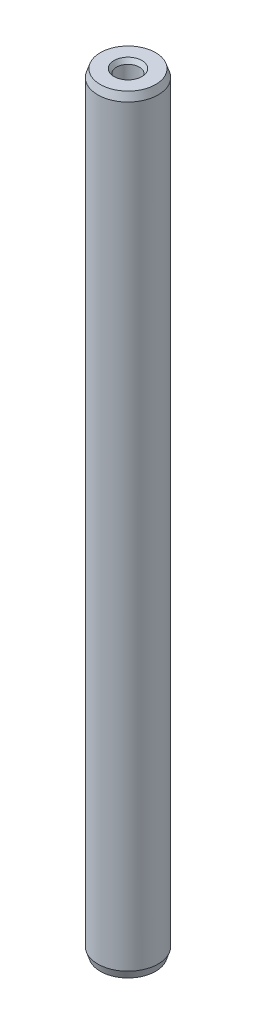
ISO-10303-21;
HEADER;
FILE_DESCRIPTION(('STEP AP214'),'2;1');
FILE_NAME('part.step','',(''),(''),'','','');
FILE_SCHEMA(('AUTOMOTIVE_DESIGN { 1 0 10303 214 1 1 1 1 }'));
ENDSEC;
DATA;
#1=APPLICATION_CONTEXT('core data for automotive mechanical design processes');
#2=APPLICATION_PROTOCOL_DEFINITION('international standard','automotive_design',2000,#1);
#3=PRODUCT_CONTEXT('',#1,'mechanical');
#4=PRODUCT('Part','Part','',(#3));
#5=PRODUCT_RELATED_PRODUCT_CATEGORY('part','',(#4));
#6=PRODUCT_DEFINITION_FORMATION('','',#4);
#7=PRODUCT_DEFINITION_CONTEXT('part definition',#1,'design');
#8=PRODUCT_DEFINITION('design','',#6,#7);
#9=PRODUCT_DEFINITION_SHAPE('','',#8);
#10=(LENGTH_UNIT() NAMED_UNIT(*) SI_UNIT(.MILLI.,.METRE.));
#11=(NAMED_UNIT(*) PLANE_ANGLE_UNIT() SI_UNIT($,.RADIAN.));
#12=(NAMED_UNIT(*) SI_UNIT($,.STERADIAN.) SOLID_ANGLE_UNIT());
#13=UNCERTAINTY_MEASURE_WITH_UNIT(LENGTH_MEASURE(1.E-05),#10,'distance_accuracy_value','');
#14=(GEOMETRIC_REPRESENTATION_CONTEXT(3) GLOBAL_UNCERTAINTY_ASSIGNED_CONTEXT((#13)) GLOBAL_UNIT_ASSIGNED_CONTEXT((#10,
#11,#12)) REPRESENTATION_CONTEXT('',''));
#15=CARTESIAN_POINT('',(0.,0.,0.));
#16=DIRECTION('',(0.,0.,1.));
#17=DIRECTION('',(1.,0.,0.));
#18=AXIS2_PLACEMENT_3D('',#15,#16,#17);
#19=CARTESIAN_POINT('',(-1.06592274227068,-29.8990630691947,-1.12643595849704));
#20=DIRECTION('',(0.,-1.,0.));
#21=DIRECTION('',(1.,0.,0.));
#22=AXIS2_PLACEMENT_3D('',#19,#20,#21);
#23=CONICAL_SURFACE('',#22,1.13029999982928,1.02974425853617);
#24=CARTESIAN_POINT('',(-1.06592274227068,-29.2199103115536,-1.12643595849704));
#25=VERTEX_POINT('',#24);
#26=VERTEX_LOOP('',#25);
#27=FACE_BOUND('',#26,.T.);
#28=CARTESIAN_POINT('',(-1.06592274227068,-29.8990630692749,-1.12643595849704));
#29=DIRECTION('',(0.,-1.,0.));
#30=DIRECTION('',(0.,0.,-1.));
#31=AXIS2_PLACEMENT_3D('',#28,#29,#30);
#32=CIRCLE('',#31,1.1303);
#33=CARTESIAN_POINT('',(-1.06592274227068,-29.8990630692749,-2.25673595849704));
#34=VERTEX_POINT('',#33);
#35=EDGE_CURVE('E38',#34,#34,#32,.T.);
#36=ORIENTED_EDGE('',*,*,#35,.T.);
#37=EDGE_LOOP('',(#36));
#38=FACE_BOUND('',#37,.T.);
#39=ADVANCED_FACE('F18',(#27,#38),#23,.F.);
#40=CARTESIAN_POINT('',(-1.06592274227068,34.8709369307016,-1.12643595849704));
#41=DIRECTION('',(0.,1.,0.));
#42=DIRECTION('',(0.,0.,1.));
#43=AXIS2_PLACEMENT_3D('',#40,#41,#42);
#44=CONICAL_SURFACE('',#43,1.13029999988612,1.02974425855837);
#45=CARTESIAN_POINT('',(-1.06592274227068,34.1917841730606,-1.12643595849704));
#46=VERTEX_POINT('',#45);
#47=VERTEX_LOOP('',#46);
#48=FACE_BOUND('',#47,.T.);
#49=CARTESIAN_POINT('',(-1.06592274227068,34.8709369307251,-1.12643595849704));
#50=DIRECTION('',(0.,1.,0.));
#51=DIRECTION('',(0.,0.,1.));
#52=AXIS2_PLACEMENT_3D('',#49,#50,#51);
#53=CIRCLE('',#52,1.1303);
#54=CARTESIAN_POINT('',(-1.06592274227068,34.8709369307251,0.00386404150295831));
#55=VERTEX_POINT('',#54);
#56=EDGE_CURVE('E40',#55,#55,#53,.T.);
#57=ORIENTED_EDGE('',*,*,#56,.T.);
#58=EDGE_LOOP('',(#57));
#59=FACE_BOUND('',#58,.T.);
#60=ADVANCED_FACE('F35',(#48,#59),#44,.F.);
#61=CARTESIAN_POINT('',(-1.06592274227068,-35.6140630692749,-1.12643595849704));
#62=DIRECTION('',(0.,-1.,0.));
#63=DIRECTION('',(0.,0.,-1.));
#64=AXIS2_PLACEMENT_3D('',#61,#62,#63);
#65=CYLINDRICAL_SURFACE('',#64,1.1303);
#66=CARTESIAN_POINT('',(-1.06592274227068,-35.1741221641078,-1.12643595849704));
#67=DIRECTION('',(0.,-1.,0.));
#68=DIRECTION('',(0.,0.,-1.));
#69=AXIS2_PLACEMENT_3D('',#66,#67,#68);
#70=CIRCLE('',#69,1.13029999999981);
#71=CARTESIAN_POINT('',(-1.06592274227068,-35.1741221641078,-2.25673595849685));
#72=VERTEX_POINT('',#71);
#73=EDGE_CURVE('E43',#72,#72,#70,.T.);
#74=ORIENTED_EDGE('',*,*,#73,.T.);
#75=EDGE_LOOP('',(#74));
#76=FACE_BOUND('',#75,.T.);
#77=ORIENTED_EDGE('',*,*,#35,.F.);
#78=EDGE_LOOP('',(#77));
#79=FACE_BOUND('',#78,.T.);
#80=ADVANCED_FACE('F148',(#76,#79),#65,.F.);
#81=CARTESIAN_POINT('',(-1.06592274227068,40.5859369307251,-1.12643595849704));
#82=DIRECTION('',(0.,1.,0.));
#83=DIRECTION('',(0.,0.,1.));
#84=AXIS2_PLACEMENT_3D('',#81,#82,#83);
#85=CYLINDRICAL_SURFACE('',#84,1.1303);
#86=CARTESIAN_POINT('',(-1.06592274227068,40.1459960256147,-1.12643595849704));
#87=DIRECTION('',(0.,1.,0.));
#88=DIRECTION('',(0.,0.,1.));
#89=AXIS2_PLACEMENT_3D('',#86,#87,#88);
#90=CIRCLE('',#89,1.13030000005665);
#91=CARTESIAN_POINT('',(-1.06592274227068,40.1459960256147,0.00386404155960918));
#92=VERTEX_POINT('',#91);
#93=EDGE_CURVE('E57',#92,#92,#90,.T.);
#94=ORIENTED_EDGE('',*,*,#93,.T.);
#95=EDGE_LOOP('',(#94));
#96=FACE_BOUND('',#95,.T.);
#97=ORIENTED_EDGE('',*,*,#56,.F.);
#98=EDGE_LOOP('',(#97));
#99=FACE_BOUND('',#98,.T.);
#100=ADVANCED_FACE('F139',(#96,#99),#85,.F.);
#101=CARTESIAN_POINT('',(-1.06592274227068,-35.6140630692607,-1.12643595849704));
#102=DIRECTION('',(0.,-1.,0.));
#103=DIRECTION('',(0.,0.,-1.));
#104=AXIS2_PLACEMENT_3D('',#101,#102,#103);
#105=CONICAL_SURFACE('',#104,1.38430000004064,0.523598775637904);
#106=CARTESIAN_POINT('',(-1.06592274227068,-35.6140630692607,-1.12643595849704));
#107=DIRECTION('',(0.,-1.,0.));
#108=DIRECTION('',(0.,0.,-1.));
#109=AXIS2_PLACEMENT_3D('',#106,#107,#108);
#110=CIRCLE('',#109,1.38430000004064);
#111=CARTESIAN_POINT('',(-1.06592274227068,-35.6140630692607,-2.51073595853768));
#112=VERTEX_POINT('',#111);
#113=EDGE_CURVE('E21',#112,#112,#110,.T.);
#114=ORIENTED_EDGE('',*,*,#113,.T.);
#115=EDGE_LOOP('',(#114));
#116=FACE_BOUND('',#115,.T.);
#117=ORIENTED_EDGE('',*,*,#73,.F.);
#118=EDGE_LOOP('',(#117));
#119=FACE_BOUND('',#118,.T.);
#120=ADVANCED_FACE('F91',(#116,#119),#105,.F.);
#121=CARTESIAN_POINT('',(-1.06592274227068,40.5859369307109,-1.12643595849704));
#122=DIRECTION('',(0.,1.,0.));
#123=DIRECTION('',(0.,0.,1.));
#124=AXIS2_PLACEMENT_3D('',#121,#122,#123);
#125=CONICAL_SURFACE('',#124,1.38430000004064,0.523598775596947);
#126=CARTESIAN_POINT('',(-1.06592274227068,40.5859369307109,-1.12643595849704));
#127=DIRECTION('',(0.,1.,0.));
#128=DIRECTION('',(0.,0.,1.));
#129=AXIS2_PLACEMENT_3D('',#126,#127,#128);
#130=CIRCLE('',#129,1.38430000004064);
#131=CARTESIAN_POINT('',(-1.06592274227068,40.5859369307109,0.257864041543598));
#132=VERTEX_POINT('',#131);
#133=EDGE_CURVE('E52',#132,#132,#130,.T.);
#134=ORIENTED_EDGE('',*,*,#133,.T.);
#135=EDGE_LOOP('',(#134));
#136=FACE_BOUND('',#135,.T.);
#137=ORIENTED_EDGE('',*,*,#93,.F.);
#138=EDGE_LOOP('',(#137));
#139=FACE_BOUND('',#138,.T.);
#140=ADVANCED_FACE('F82',(#136,#139),#125,.F.);
#141=CARTESIAN_POINT('',(1.67727725772931,-35.6140630692749,-1.12643595849704));
#142=DIRECTION('',(0.,1.,0.));
#143=DIRECTION('',(0.,0.,1.));
#144=AXIS2_PLACEMENT_3D('',#141,#142,#143);
#145=PLANE('',#144);
#146=CARTESIAN_POINT('',(-1.06592274227068,-35.6140630693176,-1.12643595849704));
#147=DIRECTION('',(0.,1.,0.));
#148=DIRECTION('',(0.,0.,1.));
#149=AXIS2_PLACEMENT_3D('',#146,#147,#148);
#150=CIRCLE('',#149,2.74319999997867);
#151=CARTESIAN_POINT('',(-1.06592274227068,-35.6140630693176,1.61676404148163));
#152=VERTEX_POINT('',#151);
#153=EDGE_CURVE('E50',#152,#152,#150,.T.);
#154=ORIENTED_EDGE('',*,*,#153,.F.);
#155=EDGE_LOOP('',(#154));
#156=FACE_BOUND('',#155,.T.);
#157=ORIENTED_EDGE('',*,*,#113,.F.);
#158=EDGE_LOOP('',(#157));
#159=FACE_BOUND('',#158,.T.);
#160=ADVANCED_FACE('F79',(#156,#159),#145,.F.);
#161=CARTESIAN_POINT('',(-1.06592274227068,40.5859369307251,-1.12643595849704));
#162=DIRECTION('',(0.,-1.,0.));
#163=DIRECTION('',(0.,0.,-1.));
#164=AXIS2_PLACEMENT_3D('',#161,#162,#163);
#165=PLANE('',#164);
#166=CARTESIAN_POINT('',(-1.06592274227068,40.5859369307109,-1.12643595849704));
#167=DIRECTION('',(0.,-1.,0.));
#168=DIRECTION('',(0.,0.,-1.));
#169=AXIS2_PLACEMENT_3D('',#166,#167,#168);
#170=CIRCLE('',#169,2.74319999999761);
#171=CARTESIAN_POINT('',(-1.06592274227068,40.5859369307109,-3.86963595849465));
#172=VERTEX_POINT('',#171);
#173=EDGE_CURVE('E47',#172,#172,#170,.T.);
#174=ORIENTED_EDGE('',*,*,#173,.F.);
#175=EDGE_LOOP('',(#174));
#176=FACE_BOUND('',#175,.T.);
#177=ORIENTED_EDGE('',*,*,#133,.F.);
#178=EDGE_LOOP('',(#177));
#179=FACE_BOUND('',#178,.T.);
#180=ADVANCED_FACE('F75',(#176,#179),#165,.F.);
#181=CARTESIAN_POINT('',(-1.06592274227068,-34.8520630694225,-1.12643595849704));
#182=DIRECTION('',(0.,1.,0.));
#183=DIRECTION('',(0.,0.,1.));
#184=AXIS2_PLACEMENT_3D('',#181,#182,#183);
#185=CONICAL_SURFACE('',#184,2.99719999992476,0.321750554374263);
#186=CARTESIAN_POINT('',(-1.06592274227068,-34.8520630692749,-1.12643595849704));
#187=DIRECTION('',(0.,1.,0.));
#188=DIRECTION('',(0.,0.,1.));
#189=AXIS2_PLACEMENT_3D('',#186,#187,#188);
#190=CIRCLE('',#189,2.9972);
#191=CARTESIAN_POINT('',(-1.06592274227068,-34.8520630692749,1.87076404150296));
#192=VERTEX_POINT('',#191);
#193=EDGE_CURVE('E27',#192,#192,#190,.T.);
#194=ORIENTED_EDGE('',*,*,#193,.F.);
#195=EDGE_LOOP('',(#194));
#196=FACE_BOUND('',#195,.T.);
#197=ORIENTED_EDGE('',*,*,#153,.T.);
#198=EDGE_LOOP('',(#197));
#199=FACE_BOUND('',#198,.T.);
#200=ADVANCED_FACE('F71',(#196,#199),#185,.T.);
#201=CARTESIAN_POINT('',(-1.06592274227068,39.8239369309294,-1.12643595849704));
#202=DIRECTION('',(0.,-1.,0.));
#203=DIRECTION('',(0.,0.,-1.));
#204=AXIS2_PLACEMENT_3D('',#201,#202,#203);
#205=CONICAL_SURFACE('',#204,2.99719999995318,0.321750554430211);
#206=CARTESIAN_POINT('',(-1.06592274227068,39.8239369307251,-1.12643595849704));
#207=DIRECTION('',(0.,1.,0.));
#208=DIRECTION('',(0.,0.,1.));
#209=AXIS2_PLACEMENT_3D('',#206,#207,#208);
#210=CIRCLE('',#209,2.9972);
#211=CARTESIAN_POINT('',(-1.06592274227068,39.8239369307251,1.87076404150296));
#212=VERTEX_POINT('',#211);
#213=EDGE_CURVE('E11',#212,#212,#210,.F.);
#214=ORIENTED_EDGE('',*,*,#213,.F.);
#215=EDGE_LOOP('',(#214));
#216=FACE_BOUND('',#215,.T.);
#217=ORIENTED_EDGE('',*,*,#173,.T.);
#218=EDGE_LOOP('',(#217));
#219=FACE_BOUND('',#218,.T.);
#220=ADVANCED_FACE('F74',(#216,#219),#205,.T.);
#221=CARTESIAN_POINT('',(-1.06592274227068,40.5859369307251,-1.12643595849704));
#222=DIRECTION('',(0.,1.,0.));
#223=DIRECTION('',(0.,0.,1.));
#224=AXIS2_PLACEMENT_3D('',#221,#222,#223);
#225=CYLINDRICAL_SURFACE('',#224,2.9972);
#226=ORIENTED_EDGE('',*,*,#213,.T.);
#227=EDGE_LOOP('',(#226));
#228=FACE_BOUND('',#227,.T.);
#229=ORIENTED_EDGE('',*,*,#193,.T.);
#230=EDGE_LOOP('',(#229));
#231=FACE_BOUND('',#230,.T.);
#232=ADVANCED_FACE('F69',(#228,#231),#225,.T.);
#233=CLOSED_SHELL('',(#39,#60,#80,#100,#120,#140,#160,#180,#200,#220,#232));
#234=MANIFOLD_SOLID_BREP('B1',#233);
#235=ADVANCED_BREP_SHAPE_REPRESENTATION('',(#18,#234),#14);
#236=SHAPE_DEFINITION_REPRESENTATION(#9,#235);
ENDSEC;
END-ISO-10303-21;
